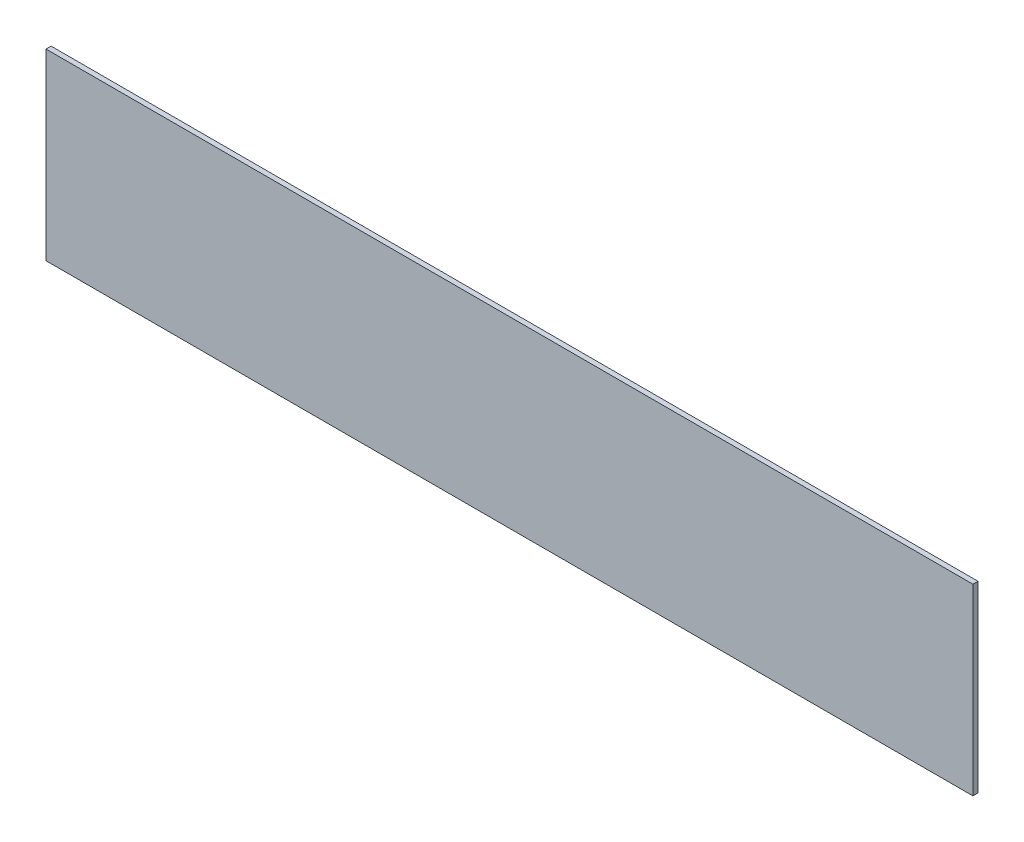
ISO-10303-21;
HEADER;
FILE_DESCRIPTION(('STEP AP214'),'2;1');
FILE_NAME('part.step','',(''),(''),'','','');
FILE_SCHEMA(('AUTOMOTIVE_DESIGN { 1 0 10303 214 1 1 1 1 }'));
ENDSEC;
DATA;
#1=APPLICATION_CONTEXT('core data for automotive mechanical design processes');
#2=APPLICATION_PROTOCOL_DEFINITION('international standard','automotive_design',2000,#1);
#3=PRODUCT_CONTEXT('',#1,'mechanical');
#4=PRODUCT('Part','Part','',(#3));
#5=PRODUCT_RELATED_PRODUCT_CATEGORY('part','',(#4));
#6=PRODUCT_DEFINITION_FORMATION('','',#4);
#7=PRODUCT_DEFINITION_CONTEXT('part definition',#1,'design');
#8=PRODUCT_DEFINITION('design','',#6,#7);
#9=PRODUCT_DEFINITION_SHAPE('','',#8);
#10=(LENGTH_UNIT() NAMED_UNIT(*) SI_UNIT(.MILLI.,.METRE.));
#11=(NAMED_UNIT(*) PLANE_ANGLE_UNIT() SI_UNIT($,.RADIAN.));
#12=(NAMED_UNIT(*) SI_UNIT($,.STERADIAN.) SOLID_ANGLE_UNIT());
#13=UNCERTAINTY_MEASURE_WITH_UNIT(LENGTH_MEASURE(1.E-05),#10,'distance_accuracy_value','');
#14=(GEOMETRIC_REPRESENTATION_CONTEXT(3) GLOBAL_UNCERTAINTY_ASSIGNED_CONTEXT((#13)) GLOBAL_UNIT_ASSIGNED_CONTEXT((#10,
#11,#12)) REPRESENTATION_CONTEXT('',''));
#15=CARTESIAN_POINT('',(0.,0.,0.));
#16=DIRECTION('',(0.,0.,1.));
#17=DIRECTION('',(1.,0.,0.));
#18=AXIS2_PLACEMENT_3D('',#15,#16,#17);
#19=CARTESIAN_POINT('',(259.,582.,27.));
#20=DIRECTION('',(1.,0.,0.));
#21=DIRECTION('',(0.,0.,-1.));
#22=AXIS2_PLACEMENT_3D('',#19,#20,#21);
#23=PLANE('',#22);
#24=DIRECTION('',(0.,-1.,0.));
#25=VECTOR('',#24,1.);
#26=CARTESIAN_POINT('',(259.,582.,26.));
#27=LINE('',#26,#25);
#28=CARTESIAN_POINT('',(259.,618.,26.));
#29=VERTEX_POINT('',#28);
#30=CARTESIAN_POINT('',(259.,582.,26.));
#31=VERTEX_POINT('',#30);
#32=EDGE_CURVE('E102',#29,#31,#27,.T.);
#33=ORIENTED_EDGE('',*,*,#32,.T.);
#34=DIRECTION('',(0.,0.,-1.));
#35=VECTOR('',#34,1.);
#36=CARTESIAN_POINT('',(259.,582.,27.));
#37=LINE('',#36,#35);
#38=CARTESIAN_POINT('',(259.,582.,27.));
#39=VERTEX_POINT('',#38);
#40=EDGE_CURVE('E11',#39,#31,#37,.T.);
#41=ORIENTED_EDGE('',*,*,#40,.F.);
#42=DIRECTION('',(0.,-1.,0.));
#43=VECTOR('',#42,1.);
#44=CARTESIAN_POINT('',(259.,582.,27.));
#45=LINE('',#44,#43);
#46=CARTESIAN_POINT('',(259.,618.,27.));
#47=VERTEX_POINT('',#46);
#48=EDGE_CURVE('E90',#47,#39,#45,.T.);
#49=ORIENTED_EDGE('',*,*,#48,.F.);
#50=DIRECTION('',(0.,0.,-1.));
#51=VECTOR('',#50,1.);
#52=CARTESIAN_POINT('',(259.,618.,27.));
#53=LINE('',#52,#51);
#54=EDGE_CURVE('E98',#47,#29,#53,.T.);
#55=ORIENTED_EDGE('',*,*,#54,.T.);
#56=EDGE_LOOP('',(#33,#41,#49,#55));
#57=FACE_BOUND('',#56,.T.);
#58=ADVANCED_FACE('F39',(#57),#23,.F.);
#59=CARTESIAN_POINT('',(259.,582.,27.));
#60=DIRECTION('',(0.,1.,0.));
#61=DIRECTION('',(0.,0.,1.));
#62=AXIS2_PLACEMENT_3D('',#59,#60,#61);
#63=PLANE('',#62);
#64=DIRECTION('',(1.,0.,0.));
#65=VECTOR('',#64,1.);
#66=CARTESIAN_POINT('',(259.,582.,26.));
#67=LINE('',#66,#65);
#68=CARTESIAN_POINT('',(441.,582.,26.));
#69=VERTEX_POINT('',#68);
#70=EDGE_CURVE('E94',#31,#69,#67,.T.);
#71=ORIENTED_EDGE('',*,*,#70,.T.);
#72=DIRECTION('',(0.,0.,-1.));
#73=VECTOR('',#72,1.);
#74=CARTESIAN_POINT('',(441.,582.,27.));
#75=LINE('',#74,#73);
#76=CARTESIAN_POINT('',(441.,582.,27.));
#77=VERTEX_POINT('',#76);
#78=EDGE_CURVE('E47',#77,#69,#75,.T.);
#79=ORIENTED_EDGE('',*,*,#78,.F.);
#80=DIRECTION('',(1.,0.,0.));
#81=VECTOR('',#80,1.);
#82=CARTESIAN_POINT('',(259.,582.,27.));
#83=LINE('',#82,#81);
#84=EDGE_CURVE('E85',#39,#77,#83,.T.);
#85=ORIENTED_EDGE('',*,*,#84,.F.);
#86=ORIENTED_EDGE('',*,*,#40,.T.);
#87=EDGE_LOOP('',(#71,#79,#85,#86));
#88=FACE_BOUND('',#87,.T.);
#89=ADVANCED_FACE('F93',(#88),#63,.F.);
#90=CARTESIAN_POINT('',(441.,582.,27.));
#91=DIRECTION('',(-1.,0.,0.));
#92=DIRECTION('',(0.,0.,1.));
#93=AXIS2_PLACEMENT_3D('',#90,#91,#92);
#94=PLANE('',#93);
#95=DIRECTION('',(0.,1.,0.));
#96=VECTOR('',#95,1.);
#97=CARTESIAN_POINT('',(441.,582.,26.));
#98=LINE('',#97,#96);
#99=CARTESIAN_POINT('',(441.,618.,26.));
#100=VERTEX_POINT('',#99);
#101=EDGE_CURVE('E72',#69,#100,#98,.T.);
#102=ORIENTED_EDGE('',*,*,#101,.T.);
#103=DIRECTION('',(0.,0.,-1.));
#104=VECTOR('',#103,1.);
#105=CARTESIAN_POINT('',(441.,618.,27.));
#106=LINE('',#105,#104);
#107=CARTESIAN_POINT('',(441.,618.,27.));
#108=VERTEX_POINT('',#107);
#109=EDGE_CURVE('E95',#108,#100,#106,.T.);
#110=ORIENTED_EDGE('',*,*,#109,.F.);
#111=DIRECTION('',(0.,1.,0.));
#112=VECTOR('',#111,1.);
#113=CARTESIAN_POINT('',(441.,582.,27.));
#114=LINE('',#113,#112);
#115=EDGE_CURVE('E88',#77,#108,#114,.T.);
#116=ORIENTED_EDGE('',*,*,#115,.F.);
#117=ORIENTED_EDGE('',*,*,#78,.T.);
#118=EDGE_LOOP('',(#102,#110,#116,#117));
#119=FACE_BOUND('',#118,.T.);
#120=ADVANCED_FACE('F96',(#119),#94,.F.);
#121=CARTESIAN_POINT('',(259.,618.,27.));
#122=DIRECTION('',(0.,-1.,0.));
#123=DIRECTION('',(0.,0.,-1.));
#124=AXIS2_PLACEMENT_3D('',#121,#122,#123);
#125=PLANE('',#124);
#126=DIRECTION('',(-1.,0.,0.));
#127=VECTOR('',#126,1.);
#128=CARTESIAN_POINT('',(259.,618.,26.));
#129=LINE('',#128,#127);
#130=EDGE_CURVE('E78',#100,#29,#129,.T.);
#131=ORIENTED_EDGE('',*,*,#130,.T.);
#132=ORIENTED_EDGE('',*,*,#54,.F.);
#133=DIRECTION('',(-1.,0.,0.));
#134=VECTOR('',#133,1.);
#135=CARTESIAN_POINT('',(259.,618.,27.));
#136=LINE('',#135,#134);
#137=EDGE_CURVE('E55',#108,#47,#136,.T.);
#138=ORIENTED_EDGE('',*,*,#137,.F.);
#139=ORIENTED_EDGE('',*,*,#109,.T.);
#140=EDGE_LOOP('',(#131,#132,#138,#139));
#141=FACE_BOUND('',#140,.T.);
#142=ADVANCED_FACE('F109',(#141),#125,.F.);
#143=CARTESIAN_POINT('',(0.,0.,27.));
#144=DIRECTION('',(0.,0.,-1.));
#145=DIRECTION('',(-1.,0.,0.));
#146=AXIS2_PLACEMENT_3D('',#143,#144,#145);
#147=PLANE('',#146);
#148=ORIENTED_EDGE('',*,*,#48,.T.);
#149=ORIENTED_EDGE('',*,*,#84,.T.);
#150=ORIENTED_EDGE('',*,*,#115,.T.);
#151=ORIENTED_EDGE('',*,*,#137,.T.);
#152=EDGE_LOOP('',(#148,#149,#150,#151));
#153=FACE_BOUND('',#152,.T.);
#154=ADVANCED_FACE('F86',(#153),#147,.F.);
#155=CARTESIAN_POINT('',(0.,0.,26.));
#156=DIRECTION('',(0.,0.,-1.));
#157=DIRECTION('',(-1.,0.,0.));
#158=AXIS2_PLACEMENT_3D('',#155,#156,#157);
#159=PLANE('',#158);
#160=ORIENTED_EDGE('',*,*,#32,.F.);
#161=ORIENTED_EDGE('',*,*,#130,.F.);
#162=ORIENTED_EDGE('',*,*,#101,.F.);
#163=ORIENTED_EDGE('',*,*,#70,.F.);
#164=EDGE_LOOP('',(#160,#161,#162,#163));
#165=FACE_BOUND('',#164,.T.);
#166=ADVANCED_FACE('F112',(#165),#159,.T.);
#167=CLOSED_SHELL('',(#58,#89,#120,#142,#154,#166));
#168=MANIFOLD_SOLID_BREP('B2',#167);
#169=ADVANCED_BREP_SHAPE_REPRESENTATION('',(#18,#168),#14);
#170=SHAPE_DEFINITION_REPRESENTATION(#9,#169);
ENDSEC;
END-ISO-10303-21;
